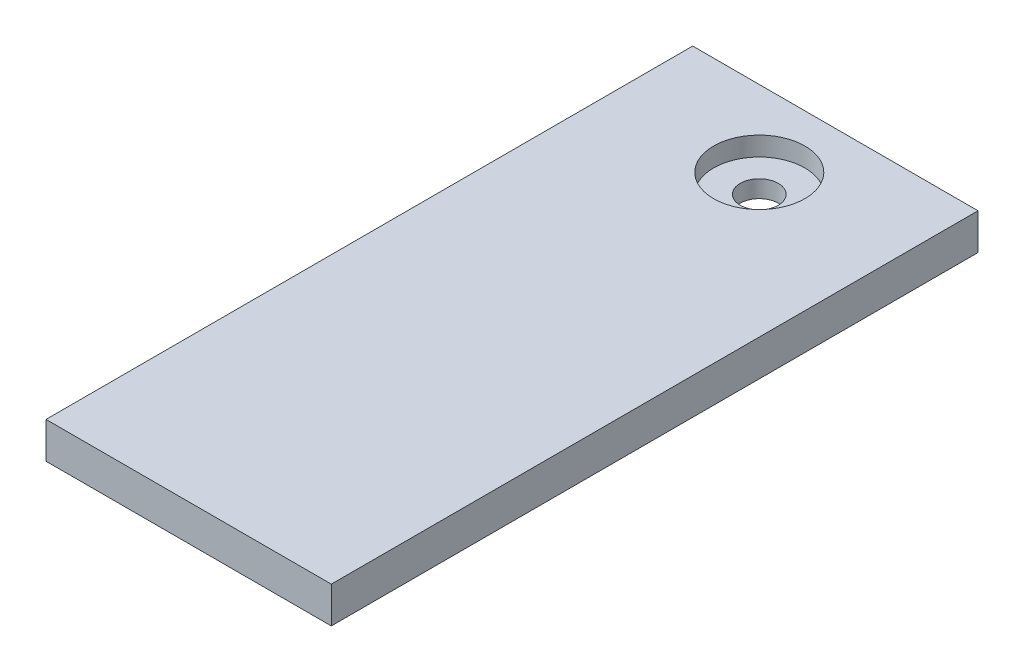
ISO-10303-21;
HEADER;
FILE_DESCRIPTION(('STEP AP214'),'2;1');
FILE_NAME('part.step','',(''),(''),'','','');
FILE_SCHEMA(('AUTOMOTIVE_DESIGN { 1 0 10303 214 1 1 1 1 }'));
ENDSEC;
DATA;
#1=APPLICATION_CONTEXT('core data for automotive mechanical design processes');
#2=APPLICATION_PROTOCOL_DEFINITION('international standard','automotive_design',2000,#1);
#3=PRODUCT_CONTEXT('',#1,'mechanical');
#4=PRODUCT('Part','Part','',(#3));
#5=PRODUCT_RELATED_PRODUCT_CATEGORY('part','',(#4));
#6=PRODUCT_DEFINITION_FORMATION('','',#4);
#7=PRODUCT_DEFINITION_CONTEXT('part definition',#1,'design');
#8=PRODUCT_DEFINITION('design','',#6,#7);
#9=PRODUCT_DEFINITION_SHAPE('','',#8);
#10=(LENGTH_UNIT() NAMED_UNIT(*) SI_UNIT(.MILLI.,.METRE.));
#11=(NAMED_UNIT(*) PLANE_ANGLE_UNIT() SI_UNIT($,.RADIAN.));
#12=(NAMED_UNIT(*) SI_UNIT($,.STERADIAN.) SOLID_ANGLE_UNIT());
#13=UNCERTAINTY_MEASURE_WITH_UNIT(LENGTH_MEASURE(1.E-05),#10,'distance_accuracy_value','');
#14=(GEOMETRIC_REPRESENTATION_CONTEXT(3) GLOBAL_UNCERTAINTY_ASSIGNED_CONTEXT((#13)) GLOBAL_UNIT_ASSIGNED_CONTEXT((#10,
#11,#12)) REPRESENTATION_CONTEXT('',''));
#15=CARTESIAN_POINT('',(0.,0.,0.));
#16=DIRECTION('',(0.,0.,1.));
#17=DIRECTION('',(1.,0.,0.));
#18=AXIS2_PLACEMENT_3D('',#15,#16,#17);
#19=CARTESIAN_POINT('',(0.,9.525,-65.));
#20=DIRECTION('',(0.,-1.,0.));
#21=DIRECTION('',(0.,0.,-1.));
#22=AXIS2_PLACEMENT_3D('',#19,#20,#21);
#23=CYLINDRICAL_SURFACE('',#22,5.);
#24=CARTESIAN_POINT('',(0.,0.,-65.));
#25=DIRECTION('',(0.,1.,0.));
#26=DIRECTION('',(0.,0.,1.));
#27=AXIS2_PLACEMENT_3D('',#24,#25,#26);
#28=CIRCLE('',#27,5.);
#29=CARTESIAN_POINT('',(0.,0.,-70.));
#30=VERTEX_POINT('',#29);
#31=EDGE_CURVE('E102',#30,#30,#28,.T.);
#32=CARTESIAN_POINT('',(0.,4.525,-65.));
#33=DIRECTION('',(0.,1.,0.));
#34=DIRECTION('',(0.,0.,1.));
#35=AXIS2_PLACEMENT_3D('',#32,#33,#34);
#36=CIRCLE('',#35,5.);
#37=CARTESIAN_POINT('',(0.,4.525,-70.));
#38=VERTEX_POINT('',#37);
#39=EDGE_CURVE('E37',#38,#38,#36,.T.);
#40=CARTESIAN_POINT('',(0.,0.,-70.));
#41=CARTESIAN_POINT('',(0.,0.0471354166666667,-70.));
#42=CARTESIAN_POINT('',(0.,0.0942708333333334,-70.));
#43=CARTESIAN_POINT('',(0.,0.188541666666667,-70.));
#44=CARTESIAN_POINT('',(0.,0.235677083333333,-70.));
#45=CARTESIAN_POINT('',(0.,0.329947916666667,-70.));
#46=CARTESIAN_POINT('',(0.,0.377083333333333,-70.));
#47=CARTESIAN_POINT('',(0.,0.471354166666667,-70.));
#48=CARTESIAN_POINT('',(0.,0.518489583333334,-70.));
#49=CARTESIAN_POINT('',(0.,0.612760416666667,-70.));
#50=CARTESIAN_POINT('',(0.,0.659895833333334,-70.));
#51=CARTESIAN_POINT('',(0.,0.754166666666667,-70.));
#52=CARTESIAN_POINT('',(0.,0.801302083333334,-70.));
#53=CARTESIAN_POINT('',(0.,0.895572916666667,-70.));
#54=CARTESIAN_POINT('',(0.,0.942708333333334,-70.));
#55=CARTESIAN_POINT('',(0.,1.03697916666667,-70.));
#56=CARTESIAN_POINT('',(0.,1.08411458333333,-70.));
#57=CARTESIAN_POINT('',(0.,1.17838541666667,-70.));
#58=CARTESIAN_POINT('',(0.,1.22552083333333,-70.));
#59=CARTESIAN_POINT('',(0.,1.31979166666667,-70.));
#60=CARTESIAN_POINT('',(0.,1.36692708333333,-70.));
#61=CARTESIAN_POINT('',(0.,1.46119791666667,-70.));
#62=CARTESIAN_POINT('',(0.,1.50833333333333,-70.));
#63=CARTESIAN_POINT('',(0.,1.60260416666667,-70.));
#64=CARTESIAN_POINT('',(0.,1.64973958333333,-70.));
#65=CARTESIAN_POINT('',(0.,1.74401041666667,-70.));
#66=CARTESIAN_POINT('',(0.,1.79114583333333,-70.));
#67=CARTESIAN_POINT('',(0.,1.88541666666667,-70.));
#68=CARTESIAN_POINT('',(0.,1.93255208333333,-70.));
#69=CARTESIAN_POINT('',(0.,2.02682291666667,-70.));
#70=CARTESIAN_POINT('',(0.,2.07395833333333,-70.));
#71=CARTESIAN_POINT('',(0.,2.16822916666667,-70.));
#72=CARTESIAN_POINT('',(0.,2.21536458333333,-70.));
#73=CARTESIAN_POINT('',(0.,2.30963541666667,-70.));
#74=CARTESIAN_POINT('',(0.,2.35677083333333,-70.));
#75=CARTESIAN_POINT('',(0.,2.45104166666667,-70.));
#76=CARTESIAN_POINT('',(0.,2.49817708333333,-70.));
#77=CARTESIAN_POINT('',(0.,2.59244791666667,-70.));
#78=CARTESIAN_POINT('',(0.,2.63958333333333,-70.));
#79=CARTESIAN_POINT('',(0.,2.73385416666667,-70.));
#80=CARTESIAN_POINT('',(0.,2.78098958333333,-70.));
#81=CARTESIAN_POINT('',(0.,2.87526041666667,-70.));
#82=CARTESIAN_POINT('',(0.,2.92239583333333,-70.));
#83=CARTESIAN_POINT('',(0.,3.01666666666667,-70.));
#84=CARTESIAN_POINT('',(0.,3.06380208333333,-70.));
#85=CARTESIAN_POINT('',(0.,3.15807291666667,-70.));
#86=CARTESIAN_POINT('',(0.,3.20520833333333,-70.));
#87=CARTESIAN_POINT('',(0.,3.29947916666667,-70.));
#88=CARTESIAN_POINT('',(0.,3.34661458333333,-70.));
#89=CARTESIAN_POINT('',(0.,3.44088541666667,-70.));
#90=CARTESIAN_POINT('',(0.,3.48802083333333,-70.));
#91=CARTESIAN_POINT('',(0.,3.58229166666667,-70.));
#92=CARTESIAN_POINT('',(0.,3.62942708333333,-70.));
#93=CARTESIAN_POINT('',(0.,3.72369791666667,-70.));
#94=CARTESIAN_POINT('',(0.,3.77083333333333,-70.));
#95=CARTESIAN_POINT('',(0.,3.86510416666667,-70.));
#96=CARTESIAN_POINT('',(0.,3.91223958333333,-70.));
#97=CARTESIAN_POINT('',(0.,4.00651041666667,-70.));
#98=CARTESIAN_POINT('',(0.,4.05364583333333,-70.));
#99=CARTESIAN_POINT('',(0.,4.14791666666667,-70.));
#100=CARTESIAN_POINT('',(0.,4.19505208333333,-70.));
#101=CARTESIAN_POINT('',(0.,4.28932291666667,-70.));
#102=CARTESIAN_POINT('',(0.,4.33645833333333,-70.));
#103=CARTESIAN_POINT('',(0.,4.43072916666667,-70.));
#104=CARTESIAN_POINT('',(0.,4.47786458333333,-70.));
#105=CARTESIAN_POINT('',(0.,4.525,-70.));
#106=B_SPLINE_CURVE_WITH_KNOTS('',3,(#40,#41,#42,#43,#44,#45,#46,#47,#48,#49,#50,#51,#52,#53,
#54,#55,#56,#57,#58,#59,#60,#61,#62,#63,#64,#65,#66,#67,#68,#69,#70,#71,#72,#73,#74,#75,#76,#77,
#78,#79,#80,#81,#82,#83,#84,#85,#86,#87,#88,#89,#90,#91,#92,#93,#94,#95,#96,#97,#98,#99,#100,
#101,#102,#103,#104,#105),.UNSPECIFIED.,.F.,.F.,(4,2,2,2,2,2,2,2,2,2,2,2,2,2,2,2,2,2,2,2,2,2,2,
2,2,2,2,2,2,2,2,2,4),(0.,0.14140625,0.2828125,0.42421875,0.565625,0.70703125,0.8484375,
0.98984375,1.13125,1.27265625,1.4140625,1.55546875,1.696875,1.83828125,1.9796875,2.12109375,
2.2625,2.40390625,2.5453125,2.68671875,2.828125,2.96953125,3.1109375,3.25234375,3.39375,
3.53515625,3.6765625,3.81796875,3.959375,4.10078125,4.2421875,4.38359375,4.525),.UNSPECIFIED.);
#107=EDGE_CURVE('BSEAM33',#30,#38,#106,.T.);
#108=ORIENTED_EDGE('',*,*,#31,.F.);
#109=ORIENTED_EDGE('',*,*,#39,.T.);
#110=ORIENTED_EDGE('',*,*,#107,.T.);
#111=ORIENTED_EDGE('',*,*,#107,.F.);
#112=EDGE_LOOP('',(#108,#110,#109,#111));
#113=FACE_BOUND('',#112,.T.);
#114=ADVANCED_FACE('F33',(#113),#23,.F.);
#115=CARTESIAN_POINT('',(0.,9.525,0.));
#116=DIRECTION('',(0.,1.,0.));
#117=DIRECTION('',(0.,0.,1.));
#118=AXIS2_PLACEMENT_3D('',#115,#116,#117);
#119=PLANE('',#118);
#120=CARTESIAN_POINT('',(0.,9.525,-65.));
#121=DIRECTION('',(0.,1.,0.));
#122=DIRECTION('',(0.,0.,1.));
#123=AXIS2_PLACEMENT_3D('',#120,#121,#122);
#124=CIRCLE('',#123,12.);
#125=CARTESIAN_POINT('',(0.,9.525,-53.));
#126=VERTEX_POINT('',#125);
#127=EDGE_CURVE('E116',#126,#126,#124,.T.);
#128=ORIENTED_EDGE('',*,*,#127,.F.);
#129=EDGE_LOOP('',(#128));
#130=FACE_BOUND('',#129,.T.);
#131=DIRECTION('',(0.,0.,1.));
#132=VECTOR('',#131,1.);
#133=CARTESIAN_POINT('',(-37.5,9.525,85.));
#134=LINE('',#133,#132);
#135=CARTESIAN_POINT('',(-37.5,9.525,-85.));
#136=VERTEX_POINT('',#135);
#137=CARTESIAN_POINT('',(-37.5,9.525,85.));
#138=VERTEX_POINT('',#137);
#139=EDGE_CURVE('E86',#136,#138,#134,.T.);
#140=ORIENTED_EDGE('',*,*,#139,.T.);
#141=DIRECTION('',(1.,0.,0.));
#142=VECTOR('',#141,1.);
#143=CARTESIAN_POINT('',(37.5,9.525,85.));
#144=LINE('',#143,#142);
#145=CARTESIAN_POINT('',(37.5,9.525,85.));
#146=VERTEX_POINT('',#145);
#147=EDGE_CURVE('E81',#138,#146,#144,.T.);
#148=ORIENTED_EDGE('',*,*,#147,.T.);
#149=DIRECTION('',(0.,0.,-1.));
#150=VECTOR('',#149,1.);
#151=CARTESIAN_POINT('',(37.5,9.525,85.));
#152=LINE('',#151,#150);
#153=CARTESIAN_POINT('',(37.5,9.525,-85.));
#154=VERTEX_POINT('',#153);
#155=EDGE_CURVE('E84',#146,#154,#152,.T.);
#156=ORIENTED_EDGE('',*,*,#155,.T.);
#157=DIRECTION('',(-1.,0.,0.));
#158=VECTOR('',#157,1.);
#159=CARTESIAN_POINT('',(37.5,9.525,-85.));
#160=LINE('',#159,#158);
#161=EDGE_CURVE('E51',#154,#136,#160,.T.);
#162=ORIENTED_EDGE('',*,*,#161,.T.);
#163=EDGE_LOOP('',(#140,#148,#156,#162));
#164=FACE_BOUND('',#163,.T.);
#165=ADVANCED_FACE('F82',(#130,#164),#119,.T.);
#166=CARTESIAN_POINT('',(0.,0.,0.));
#167=DIRECTION('',(0.,1.,0.));
#168=DIRECTION('',(0.,0.,1.));
#169=AXIS2_PLACEMENT_3D('',#166,#167,#168);
#170=PLANE('',#169);
#171=DIRECTION('',(0.,0.,1.));
#172=VECTOR('',#171,1.);
#173=CARTESIAN_POINT('',(-37.5,0.,85.));
#174=LINE('',#173,#172);
#175=CARTESIAN_POINT('',(-37.5,0.,-85.));
#176=VERTEX_POINT('',#175);
#177=CARTESIAN_POINT('',(-37.5,0.,85.));
#178=VERTEX_POINT('',#177);
#179=EDGE_CURVE('E99',#176,#178,#174,.T.);
#180=ORIENTED_EDGE('',*,*,#179,.F.);
#181=DIRECTION('',(-1.,0.,0.));
#182=VECTOR('',#181,1.);
#183=CARTESIAN_POINT('',(37.5,0.,-85.));
#184=LINE('',#183,#182);
#185=CARTESIAN_POINT('',(37.5,0.,-85.));
#186=VERTEX_POINT('',#185);
#187=EDGE_CURVE('E74',#186,#176,#184,.T.);
#188=ORIENTED_EDGE('',*,*,#187,.F.);
#189=DIRECTION('',(0.,0.,-1.));
#190=VECTOR('',#189,1.);
#191=CARTESIAN_POINT('',(37.5,0.,85.));
#192=LINE('',#191,#190);
#193=CARTESIAN_POINT('',(37.5,0.,85.));
#194=VERTEX_POINT('',#193);
#195=EDGE_CURVE('E68',#194,#186,#192,.T.);
#196=ORIENTED_EDGE('',*,*,#195,.F.);
#197=DIRECTION('',(1.,0.,0.));
#198=VECTOR('',#197,1.);
#199=CARTESIAN_POINT('',(37.5,0.,85.));
#200=LINE('',#199,#198);
#201=EDGE_CURVE('E90',#178,#194,#200,.T.);
#202=ORIENTED_EDGE('',*,*,#201,.F.);
#203=EDGE_LOOP('',(#180,#188,#196,#202));
#204=FACE_BOUND('',#203,.T.);
#205=ORIENTED_EDGE('',*,*,#31,.T.);
#206=EDGE_LOOP('',(#205));
#207=FACE_BOUND('',#206,.T.);
#208=ADVANCED_FACE('F110',(#204,#207),#170,.F.);
#209=CARTESIAN_POINT('',(-37.5,9.525,85.));
#210=DIRECTION('',(1.,0.,0.));
#211=DIRECTION('',(0.,0.,-1.));
#212=AXIS2_PLACEMENT_3D('',#209,#210,#211);
#213=PLANE('',#212);
#214=ORIENTED_EDGE('',*,*,#179,.T.);
#215=DIRECTION('',(0.,-1.,0.));
#216=VECTOR('',#215,1.);
#217=CARTESIAN_POINT('',(-37.5,9.525,85.));
#218=LINE('',#217,#216);
#219=EDGE_CURVE('E11',#138,#178,#218,.T.);
#220=ORIENTED_EDGE('',*,*,#219,.F.);
#221=ORIENTED_EDGE('',*,*,#139,.F.);
#222=DIRECTION('',(0.,-1.,0.));
#223=VECTOR('',#222,1.);
#224=CARTESIAN_POINT('',(-37.5,9.525,-85.));
#225=LINE('',#224,#223);
#226=EDGE_CURVE('E95',#136,#176,#225,.T.);
#227=ORIENTED_EDGE('',*,*,#226,.T.);
#228=EDGE_LOOP('',(#214,#220,#221,#227));
#229=FACE_BOUND('',#228,.T.);
#230=ADVANCED_FACE('F35',(#229),#213,.F.);
#231=CARTESIAN_POINT('',(37.5,9.525,85.));
#232=DIRECTION('',(0.,0.,-1.));
#233=DIRECTION('',(-1.,0.,0.));
#234=AXIS2_PLACEMENT_3D('',#231,#232,#233);
#235=PLANE('',#234);
#236=ORIENTED_EDGE('',*,*,#201,.T.);
#237=DIRECTION('',(0.,-1.,0.));
#238=VECTOR('',#237,1.);
#239=CARTESIAN_POINT('',(37.5,9.525,85.));
#240=LINE('',#239,#238);
#241=EDGE_CURVE('E43',#146,#194,#240,.T.);
#242=ORIENTED_EDGE('',*,*,#241,.F.);
#243=ORIENTED_EDGE('',*,*,#147,.F.);
#244=ORIENTED_EDGE('',*,*,#219,.T.);
#245=EDGE_LOOP('',(#236,#242,#243,#244));
#246=FACE_BOUND('',#245,.T.);
#247=ADVANCED_FACE('F89',(#246),#235,.F.);
#248=CARTESIAN_POINT('',(37.5,9.525,85.));
#249=DIRECTION('',(-1.,0.,0.));
#250=DIRECTION('',(0.,0.,1.));
#251=AXIS2_PLACEMENT_3D('',#248,#249,#250);
#252=PLANE('',#251);
#253=ORIENTED_EDGE('',*,*,#195,.T.);
#254=DIRECTION('',(0.,-1.,0.));
#255=VECTOR('',#254,1.);
#256=CARTESIAN_POINT('',(37.5,9.525,-85.));
#257=LINE('',#256,#255);
#258=EDGE_CURVE('E91',#154,#186,#257,.T.);
#259=ORIENTED_EDGE('',*,*,#258,.F.);
#260=ORIENTED_EDGE('',*,*,#155,.F.);
#261=ORIENTED_EDGE('',*,*,#241,.T.);
#262=EDGE_LOOP('',(#253,#259,#260,#261));
#263=FACE_BOUND('',#262,.T.);
#264=ADVANCED_FACE('F93',(#263),#252,.F.);
#265=CARTESIAN_POINT('',(37.5,9.525,-85.));
#266=DIRECTION('',(0.,0.,1.));
#267=DIRECTION('',(1.,0.,0.));
#268=AXIS2_PLACEMENT_3D('',#265,#266,#267);
#269=PLANE('',#268);
#270=ORIENTED_EDGE('',*,*,#187,.T.);
#271=ORIENTED_EDGE('',*,*,#226,.F.);
#272=ORIENTED_EDGE('',*,*,#161,.F.);
#273=ORIENTED_EDGE('',*,*,#258,.T.);
#274=EDGE_LOOP('',(#270,#271,#272,#273));
#275=FACE_BOUND('',#274,.T.);
#276=ADVANCED_FACE('F107',(#275),#269,.F.);
#277=CARTESIAN_POINT('',(0.,4.525,-65.));
#278=DIRECTION('',(0.,1.,0.));
#279=DIRECTION('',(0.,0.,1.));
#280=AXIS2_PLACEMENT_3D('',#277,#278,#279);
#281=CYLINDRICAL_SURFACE('',#280,12.);
#282=CARTESIAN_POINT('',(0.,4.525,-65.));
#283=DIRECTION('',(0.,1.,0.));
#284=DIRECTION('',(0.,0.,1.));
#285=AXIS2_PLACEMENT_3D('',#282,#283,#284);
#286=CIRCLE('',#285,12.);
#287=CARTESIAN_POINT('',(0.,4.525,-53.));
#288=VERTEX_POINT('',#287);
#289=EDGE_CURVE('E119',#288,#288,#286,.T.);
#290=ORIENTED_EDGE('',*,*,#289,.F.);
#291=EDGE_LOOP('',(#290));
#292=FACE_BOUND('',#291,.T.);
#293=ORIENTED_EDGE('',*,*,#127,.T.);
#294=EDGE_LOOP('',(#293));
#295=FACE_BOUND('',#294,.T.);
#296=ADVANCED_FACE('F129',(#292,#295),#281,.F.);
#297=CARTESIAN_POINT('',(0.,4.525,-65.));
#298=DIRECTION('',(0.,1.,0.));
#299=DIRECTION('',(0.,0.,1.));
#300=AXIS2_PLACEMENT_3D('',#297,#298,#299);
#301=PLANE('',#300);
#302=ORIENTED_EDGE('',*,*,#39,.F.);
#303=EDGE_LOOP('',(#302));
#304=FACE_BOUND('',#303,.T.);
#305=ORIENTED_EDGE('',*,*,#289,.T.);
#306=EDGE_LOOP('',(#305));
#307=FACE_BOUND('',#306,.T.);
#308=ADVANCED_FACE('F127',(#304,#307),#301,.T.);
#309=CLOSED_SHELL('',(#114,#165,#208,#230,#247,#264,#276,#296,#308));
#310=MANIFOLD_SOLID_BREP('B2',#309);
#311=ADVANCED_BREP_SHAPE_REPRESENTATION('',(#18,#310),#14);
#312=SHAPE_DEFINITION_REPRESENTATION(#9,#311);
ENDSEC;
END-ISO-10303-21;
